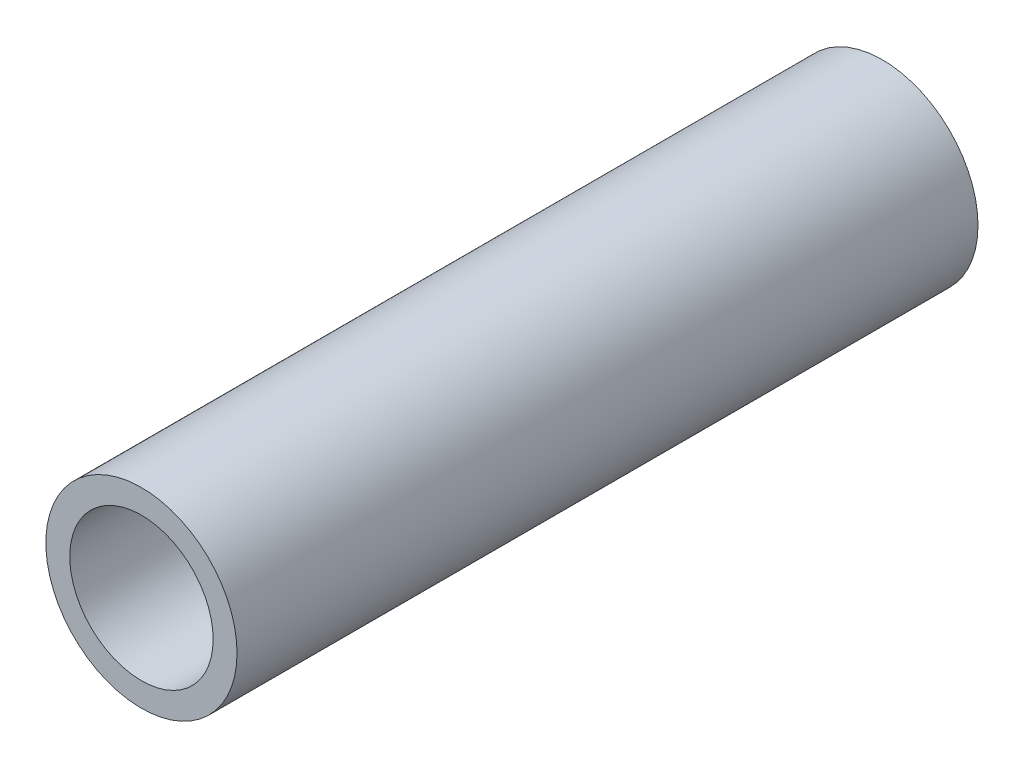
ISO-10303-21;
HEADER;
FILE_DESCRIPTION(('STEP AP214'),'2;1');
FILE_NAME('part.step','',(''),(''),'','','');
FILE_SCHEMA(('AUTOMOTIVE_DESIGN { 1 0 10303 214 1 1 1 1 }'));
ENDSEC;
DATA;
#1=APPLICATION_CONTEXT('core data for automotive mechanical design processes');
#2=APPLICATION_PROTOCOL_DEFINITION('international standard','automotive_design',2000,#1);
#3=PRODUCT_CONTEXT('',#1,'mechanical');
#4=PRODUCT('Part','Part','',(#3));
#5=PRODUCT_RELATED_PRODUCT_CATEGORY('part','',(#4));
#6=PRODUCT_DEFINITION_FORMATION('','',#4);
#7=PRODUCT_DEFINITION_CONTEXT('part definition',#1,'design');
#8=PRODUCT_DEFINITION('design','',#6,#7);
#9=PRODUCT_DEFINITION_SHAPE('','',#8);
#10=(LENGTH_UNIT() NAMED_UNIT(*) SI_UNIT(.MILLI.,.METRE.));
#11=(NAMED_UNIT(*) PLANE_ANGLE_UNIT() SI_UNIT($,.RADIAN.));
#12=(NAMED_UNIT(*) SI_UNIT($,.STERADIAN.) SOLID_ANGLE_UNIT());
#13=UNCERTAINTY_MEASURE_WITH_UNIT(LENGTH_MEASURE(1.E-05),#10,'distance_accuracy_value','');
#14=(GEOMETRIC_REPRESENTATION_CONTEXT(3) GLOBAL_UNCERTAINTY_ASSIGNED_CONTEXT((#13)) GLOBAL_UNIT_ASSIGNED_CONTEXT((#10,
#11,#12)) REPRESENTATION_CONTEXT('',''));
#15=CARTESIAN_POINT('',(0.,0.,0.));
#16=DIRECTION('',(0.,0.,1.));
#17=DIRECTION('',(1.,0.,0.));
#18=AXIS2_PLACEMENT_3D('',#15,#16,#17);
#19=CARTESIAN_POINT('',(0.,0.,62.));
#20=DIRECTION('',(0.,0.,1.));
#21=DIRECTION('',(1.,0.,0.));
#22=AXIS2_PLACEMENT_3D('',#19,#20,#21);
#23=PLANE('',#22);
#24=CARTESIAN_POINT('',(0.,0.,62.));
#25=DIRECTION('',(0.,0.,1.));
#26=DIRECTION('',(1.,0.,0.));
#27=AXIS2_PLACEMENT_3D('',#24,#25,#26);
#28=CIRCLE('',#27,8.);
#29=CARTESIAN_POINT('',(8.,0.,62.));
#30=VERTEX_POINT('',#29);
#31=EDGE_CURVE('E10',#30,#30,#28,.T.);
#32=ORIENTED_EDGE('',*,*,#31,.T.);
#33=EDGE_LOOP('',(#32));
#34=FACE_BOUND('',#33,.T.);
#35=CARTESIAN_POINT('',(0.,0.,62.));
#36=DIRECTION('',(0.,0.,1.));
#37=DIRECTION('',(1.,0.,0.));
#38=AXIS2_PLACEMENT_3D('',#35,#36,#37);
#39=CIRCLE('',#38,6.);
#40=CARTESIAN_POINT('',(6.,0.,62.));
#41=VERTEX_POINT('',#40);
#42=EDGE_CURVE('E57',#41,#41,#39,.T.);
#43=ORIENTED_EDGE('',*,*,#42,.F.);
#44=EDGE_LOOP('',(#43));
#45=FACE_BOUND('',#44,.T.);
#46=ADVANCED_FACE('F43',(#34,#45),#23,.T.);
#47=CARTESIAN_POINT('',(0.,0.,0.));
#48=DIRECTION('',(0.,0.,1.));
#49=DIRECTION('',(1.,0.,0.));
#50=AXIS2_PLACEMENT_3D('',#47,#48,#49);
#51=PLANE('',#50);
#52=CARTESIAN_POINT('',(0.,0.,0.));
#53=DIRECTION('',(0.,0.,1.));
#54=DIRECTION('',(1.,0.,0.));
#55=AXIS2_PLACEMENT_3D('',#52,#53,#54);
#56=CIRCLE('',#55,8.);
#57=CARTESIAN_POINT('',(8.,0.,0.));
#58=VERTEX_POINT('',#57);
#59=EDGE_CURVE('E48',#58,#58,#56,.T.);
#60=ORIENTED_EDGE('',*,*,#59,.F.);
#61=EDGE_LOOP('',(#60));
#62=FACE_BOUND('',#61,.T.);
#63=CARTESIAN_POINT('',(0.,0.,0.));
#64=DIRECTION('',(0.,0.,1.));
#65=DIRECTION('',(1.,0.,0.));
#66=AXIS2_PLACEMENT_3D('',#63,#64,#65);
#67=CIRCLE('',#66,6.);
#68=CARTESIAN_POINT('',(6.,0.,0.));
#69=VERTEX_POINT('',#68);
#70=EDGE_CURVE('E59',#69,#69,#67,.T.);
#71=ORIENTED_EDGE('',*,*,#70,.T.);
#72=EDGE_LOOP('',(#71));
#73=FACE_BOUND('',#72,.T.);
#74=ADVANCED_FACE('F71',(#62,#73),#51,.F.);
#75=CARTESIAN_POINT('',(0.,0.,62.));
#76=DIRECTION('',(0.,0.,-1.));
#77=DIRECTION('',(-1.,0.,0.));
#78=AXIS2_PLACEMENT_3D('',#75,#76,#77);
#79=CYLINDRICAL_SURFACE('',#78,8.);
#80=ORIENTED_EDGE('',*,*,#31,.F.);
#81=EDGE_LOOP('',(#80));
#82=FACE_BOUND('',#81,.T.);
#83=ORIENTED_EDGE('',*,*,#59,.T.);
#84=EDGE_LOOP('',(#83));
#85=FACE_BOUND('',#84,.T.);
#86=ADVANCED_FACE('F46',(#82,#85),#79,.T.);
#87=CARTESIAN_POINT('',(0.,0.,62.));
#88=DIRECTION('',(0.,0.,-1.));
#89=DIRECTION('',(-1.,0.,0.));
#90=AXIS2_PLACEMENT_3D('',#87,#88,#89);
#91=CYLINDRICAL_SURFACE('',#90,6.);
#92=ORIENTED_EDGE('',*,*,#42,.T.);
#93=EDGE_LOOP('',(#92));
#94=FACE_BOUND('',#93,.T.);
#95=ORIENTED_EDGE('',*,*,#70,.F.);
#96=EDGE_LOOP('',(#95));
#97=FACE_BOUND('',#96,.T.);
#98=ADVANCED_FACE('F67',(#94,#97),#91,.F.);
#99=CLOSED_SHELL('',(#46,#74,#86,#98));
#100=MANIFOLD_SOLID_BREP('B2',#99);
#101=ADVANCED_BREP_SHAPE_REPRESENTATION('',(#18,#100),#14);
#102=SHAPE_DEFINITION_REPRESENTATION(#9,#101);
ENDSEC;
END-ISO-10303-21;
